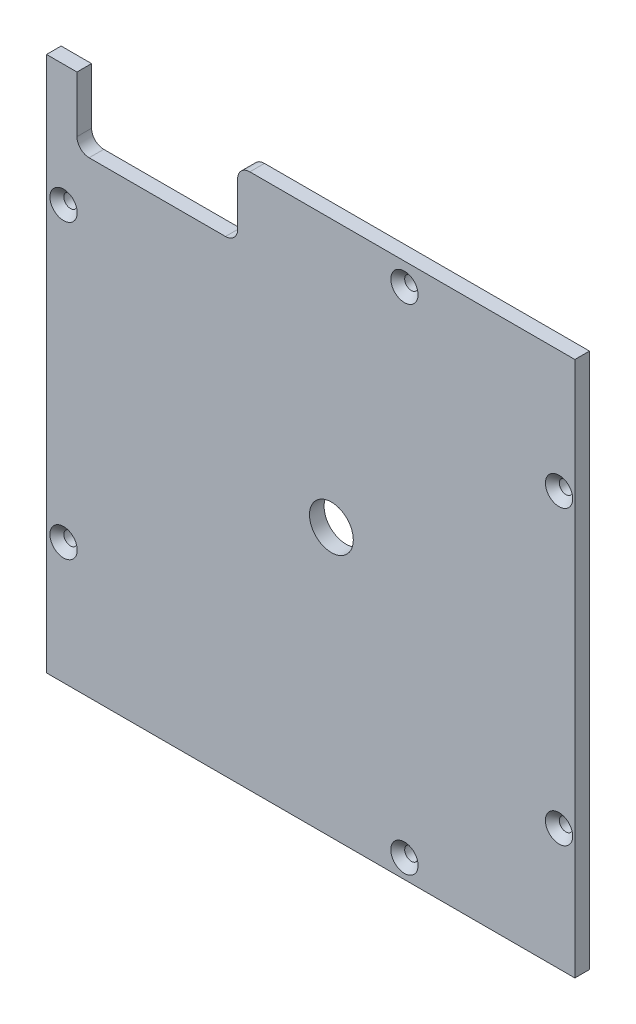
ISO-10303-21;
HEADER;
FILE_DESCRIPTION(('STEP AP214'),'2;1');
FILE_NAME('part.step','',(''),(''),'','','');
FILE_SCHEMA(('AUTOMOTIVE_DESIGN { 1 0 10303 214 1 1 1 1 }'));
ENDSEC;
DATA;
#1=APPLICATION_CONTEXT('core data for automotive mechanical design processes');
#2=APPLICATION_PROTOCOL_DEFINITION('international standard','automotive_design',2000,#1);
#3=PRODUCT_CONTEXT('',#1,'mechanical');
#4=PRODUCT('Part','Part','',(#3));
#5=PRODUCT_RELATED_PRODUCT_CATEGORY('part','',(#4));
#6=PRODUCT_DEFINITION_FORMATION('','',#4);
#7=PRODUCT_DEFINITION_CONTEXT('part definition',#1,'design');
#8=PRODUCT_DEFINITION('design','',#6,#7);
#9=PRODUCT_DEFINITION_SHAPE('','',#8);
#10=(LENGTH_UNIT() NAMED_UNIT(*) SI_UNIT(.MILLI.,.METRE.));
#11=(NAMED_UNIT(*) PLANE_ANGLE_UNIT() SI_UNIT($,.RADIAN.));
#12=(NAMED_UNIT(*) SI_UNIT($,.STERADIAN.) SOLID_ANGLE_UNIT());
#13=UNCERTAINTY_MEASURE_WITH_UNIT(LENGTH_MEASURE(1.E-05),#10,'distance_accuracy_value','');
#14=(GEOMETRIC_REPRESENTATION_CONTEXT(3) GLOBAL_UNCERTAINTY_ASSIGNED_CONTEXT((#13)) GLOBAL_UNIT_ASSIGNED_CONTEXT((#10,
#11,#12)) REPRESENTATION_CONTEXT('',''));
#15=CARTESIAN_POINT('',(0.,0.,0.));
#16=DIRECTION('',(0.,0.,1.));
#17=DIRECTION('',(1.,0.,0.));
#18=AXIS2_PLACEMENT_3D('',#15,#16,#17);
#19=CARTESIAN_POINT('',(-117.,110.,6.));
#20=DIRECTION('',(0.,-1.,0.));
#21=DIRECTION('',(0.,0.,-1.));
#22=AXIS2_PLACEMENT_3D('',#19,#20,#21);
#23=PLANE('',#22);
#24=DIRECTION('',(-1.,0.,0.));
#25=VECTOR('',#24,1.);
#26=CARTESIAN_POINT('',(-117.,110.,6.));
#27=LINE('',#26,#25);
#28=CARTESIAN_POINT('',(-104.5,110.,6.));
#29=VERTEX_POINT('',#28);
#30=CARTESIAN_POINT('',(-117.,110.,6.));
#31=VERTEX_POINT('',#30);
#32=EDGE_CURVE('E138',#29,#31,#27,.T.);
#33=ORIENTED_EDGE('',*,*,#32,.F.);
#34=DIRECTION('',(0.,0.,1.));
#35=VECTOR('',#34,1.);
#36=CARTESIAN_POINT('',(-104.5,110.,0.));
#37=LINE('',#36,#35);
#38=CARTESIAN_POINT('',(-104.5,110.,0.));
#39=VERTEX_POINT('',#38);
#40=EDGE_CURVE('E124',#39,#29,#37,.T.);
#41=ORIENTED_EDGE('',*,*,#40,.F.);
#42=DIRECTION('',(-1.,0.,0.));
#43=VECTOR('',#42,1.);
#44=CARTESIAN_POINT('',(-117.,110.,0.));
#45=LINE('',#44,#43);
#46=CARTESIAN_POINT('',(-117.,110.,0.));
#47=VERTEX_POINT('',#46);
#48=EDGE_CURVE('E136',#39,#47,#45,.T.);
#49=ORIENTED_EDGE('',*,*,#48,.T.);
#50=DIRECTION('',(0.,0.,-1.));
#51=VECTOR('',#50,1.);
#52=CARTESIAN_POINT('',(-117.,110.,6.));
#53=LINE('',#52,#51);
#54=EDGE_CURVE('E155',#31,#47,#53,.T.);
#55=ORIENTED_EDGE('',*,*,#54,.F.);
#56=EDGE_LOOP('',(#33,#41,#49,#55));
#57=FACE_BOUND('',#56,.T.);
#58=ADVANCED_FACE('F36',(#57),#23,.F.);
#59=CARTESIAN_POINT('',(-117.,110.,6.));
#60=DIRECTION('',(1.,0.,0.));
#61=DIRECTION('',(0.,0.,-1.));
#62=AXIS2_PLACEMENT_3D('',#59,#60,#61);
#63=PLANE('',#62);
#64=DIRECTION('',(0.,-1.,0.));
#65=VECTOR('',#64,1.);
#66=CARTESIAN_POINT('',(-117.,110.,0.));
#67=LINE('',#66,#65);
#68=CARTESIAN_POINT('',(-117.,-110.,0.));
#69=VERTEX_POINT('',#68);
#70=EDGE_CURVE('E146',#47,#69,#67,.T.);
#71=ORIENTED_EDGE('',*,*,#70,.T.);
#72=DIRECTION('',(0.,0.,-1.));
#73=VECTOR('',#72,1.);
#74=CARTESIAN_POINT('',(-117.,-110.,6.));
#75=LINE('',#74,#73);
#76=CARTESIAN_POINT('',(-117.,-110.,6.));
#77=VERTEX_POINT('',#76);
#78=EDGE_CURVE('E164',#77,#69,#75,.T.);
#79=ORIENTED_EDGE('',*,*,#78,.F.);
#80=DIRECTION('',(0.,-1.,0.));
#81=VECTOR('',#80,1.);
#82=CARTESIAN_POINT('',(-117.,110.,6.));
#83=LINE('',#82,#81);
#84=EDGE_CURVE('E150',#31,#77,#83,.T.);
#85=ORIENTED_EDGE('',*,*,#84,.F.);
#86=ORIENTED_EDGE('',*,*,#54,.T.);
#87=EDGE_LOOP('',(#71,#79,#85,#86));
#88=FACE_BOUND('',#87,.T.);
#89=ADVANCED_FACE('F298',(#88),#63,.F.);
#90=CARTESIAN_POINT('',(-117.,-110.,6.));
#91=DIRECTION('',(0.,1.,0.));
#92=DIRECTION('',(0.,0.,1.));
#93=AXIS2_PLACEMENT_3D('',#90,#91,#92);
#94=PLANE('',#93);
#95=DIRECTION('',(1.,0.,0.));
#96=VECTOR('',#95,1.);
#97=CARTESIAN_POINT('',(-117.,-110.,0.));
#98=LINE('',#97,#96);
#99=CARTESIAN_POINT('',(100.,-110.,0.));
#100=VERTEX_POINT('',#99);
#101=EDGE_CURVE('E151',#69,#100,#98,.T.);
#102=ORIENTED_EDGE('',*,*,#101,.T.);
#103=DIRECTION('',(0.,0.,-1.));
#104=VECTOR('',#103,1.);
#105=CARTESIAN_POINT('',(100.,-110.,6.));
#106=LINE('',#105,#104);
#107=CARTESIAN_POINT('',(100.,-110.,6.));
#108=VERTEX_POINT('',#107);
#109=EDGE_CURVE('E161',#108,#100,#106,.T.);
#110=ORIENTED_EDGE('',*,*,#109,.F.);
#111=DIRECTION('',(1.,0.,0.));
#112=VECTOR('',#111,1.);
#113=CARTESIAN_POINT('',(-117.,-110.,6.));
#114=LINE('',#113,#112);
#115=EDGE_CURVE('E275',#77,#108,#114,.T.);
#116=ORIENTED_EDGE('',*,*,#115,.F.);
#117=ORIENTED_EDGE('',*,*,#78,.T.);
#118=EDGE_LOOP('',(#102,#110,#116,#117));
#119=FACE_BOUND('',#118,.T.);
#120=ADVANCED_FACE('F282',(#119),#94,.F.);
#121=CARTESIAN_POINT('',(100.,110.,6.));
#122=DIRECTION('',(-1.,0.,0.));
#123=DIRECTION('',(0.,0.,1.));
#124=AXIS2_PLACEMENT_3D('',#121,#122,#123);
#125=PLANE('',#124);
#126=DIRECTION('',(0.,1.,0.));
#127=VECTOR('',#126,1.);
#128=CARTESIAN_POINT('',(100.,110.,0.));
#129=LINE('',#128,#127);
#130=CARTESIAN_POINT('',(100.,110.,0.));
#131=VERTEX_POINT('',#130);
#132=EDGE_CURVE('E148',#100,#131,#129,.T.);
#133=ORIENTED_EDGE('',*,*,#132,.T.);
#134=DIRECTION('',(0.,0.,-1.));
#135=VECTOR('',#134,1.);
#136=CARTESIAN_POINT('',(100.,110.,6.));
#137=LINE('',#136,#135);
#138=CARTESIAN_POINT('',(100.,110.,6.));
#139=VERTEX_POINT('',#138);
#140=EDGE_CURVE('E157',#139,#131,#137,.T.);
#141=ORIENTED_EDGE('',*,*,#140,.F.);
#142=DIRECTION('',(0.,1.,0.));
#143=VECTOR('',#142,1.);
#144=CARTESIAN_POINT('',(100.,110.,6.));
#145=LINE('',#144,#143);
#146=EDGE_CURVE('E277',#108,#139,#145,.T.);
#147=ORIENTED_EDGE('',*,*,#146,.F.);
#148=ORIENTED_EDGE('',*,*,#109,.T.);
#149=EDGE_LOOP('',(#133,#141,#147,#148));
#150=FACE_BOUND('',#149,.T.);
#151=ADVANCED_FACE('F287',(#150),#125,.F.);
#152=CARTESIAN_POINT('',(-33.5,110.,0.));
#153=VERTEX_POINT('',#152);
#154=EDGE_CURVE('E147',#131,#153,#45,.T.);
#155=ORIENTED_EDGE('',*,*,#154,.T.);
#156=DIRECTION('',(0.,0.,1.));
#157=VECTOR('',#156,1.);
#158=CARTESIAN_POINT('',(-33.5,110.,6.));
#159=LINE('',#158,#157);
#160=CARTESIAN_POINT('',(-33.5,110.,6.));
#161=VERTEX_POINT('',#160);
#162=EDGE_CURVE('E178',#153,#161,#159,.T.);
#163=ORIENTED_EDGE('',*,*,#162,.T.);
#164=EDGE_CURVE('E158',#139,#161,#27,.T.);
#165=ORIENTED_EDGE('',*,*,#164,.F.);
#166=ORIENTED_EDGE('',*,*,#140,.T.);
#167=EDGE_LOOP('',(#155,#163,#165,#166));
#168=FACE_BOUND('',#167,.T.);
#169=ADVANCED_FACE('F290',(#168),#23,.F.);
#170=CARTESIAN_POINT('',(0.,0.,6.));
#171=DIRECTION('',(0.,0.,1.));
#172=DIRECTION('',(1.,0.,0.));
#173=AXIS2_PLACEMENT_3D('',#170,#171,#172);
#174=PLANE('',#173);
#175=ORIENTED_EDGE('',*,*,#164,.T.);
#176=CARTESIAN_POINT('',(-33.5,105.,6.));
#177=DIRECTION('',(0.,0.,1.));
#178=DIRECTION('',(1.,0.,0.));
#179=AXIS2_PLACEMENT_3D('',#176,#177,#178);
#180=CIRCLE('',#179,5.);
#181=CARTESIAN_POINT('',(-38.5,105.,6.));
#182=VERTEX_POINT('',#181);
#183=EDGE_CURVE('E51',#161,#182,#180,.T.);
#184=ORIENTED_EDGE('',*,*,#183,.T.);
#185=DIRECTION('',(0.,1.,0.));
#186=VECTOR('',#185,1.);
#187=CARTESIAN_POINT('',(-38.5,110.,6.));
#188=LINE('',#187,#186);
#189=CARTESIAN_POINT('',(-38.5,87.,6.));
#190=VERTEX_POINT('',#189);
#191=EDGE_CURVE('E131',#190,#182,#188,.T.);
#192=ORIENTED_EDGE('',*,*,#191,.F.);
#193=CARTESIAN_POINT('',(-43.5,87.,6.));
#194=DIRECTION('',(0.,0.,1.));
#195=DIRECTION('',(1.,0.,0.));
#196=AXIS2_PLACEMENT_3D('',#193,#194,#195);
#197=CIRCLE('',#196,5.);
#198=CARTESIAN_POINT('',(-43.5,82.,6.));
#199=VERTEX_POINT('',#198);
#200=EDGE_CURVE('E44',#190,#199,#197,.F.);
#201=ORIENTED_EDGE('',*,*,#200,.T.);
#202=DIRECTION('',(1.,0.,0.));
#203=VECTOR('',#202,1.);
#204=CARTESIAN_POINT('',(-104.5,82.,6.));
#205=LINE('',#204,#203);
#206=CARTESIAN_POINT('',(-99.5,82.,6.));
#207=VERTEX_POINT('',#206);
#208=EDGE_CURVE('E192',#207,#199,#205,.T.);
#209=ORIENTED_EDGE('',*,*,#208,.F.);
#210=CARTESIAN_POINT('',(-99.5,87.,6.));
#211=DIRECTION('',(0.,0.,1.));
#212=DIRECTION('',(1.,0.,0.));
#213=AXIS2_PLACEMENT_3D('',#210,#211,#212);
#214=CIRCLE('',#213,5.);
#215=CARTESIAN_POINT('',(-104.5,87.,6.));
#216=VERTEX_POINT('',#215);
#217=EDGE_CURVE('E182',#207,#216,#214,.F.);
#218=ORIENTED_EDGE('',*,*,#217,.T.);
#219=DIRECTION('',(0.,-1.,0.));
#220=VECTOR('',#219,1.);
#221=CARTESIAN_POINT('',(-104.5,110.,6.));
#222=LINE('',#221,#220);
#223=EDGE_CURVE('E202',#29,#216,#222,.T.);
#224=ORIENTED_EDGE('',*,*,#223,.F.);
#225=ORIENTED_EDGE('',*,*,#32,.T.);
#226=ORIENTED_EDGE('',*,*,#84,.T.);
#227=ORIENTED_EDGE('',*,*,#115,.T.);
#228=ORIENTED_EDGE('',*,*,#146,.T.);
#229=EDGE_LOOP('',(#175,#184,#192,#201,#209,#218,#224,#225,#226,#227,#228));
#230=FACE_BOUND('',#229,.T.);
#231=CARTESIAN_POINT('',(0.,0.299999999999981,6.));
#232=DIRECTION('',(0.,0.,1.));
#233=DIRECTION('',(1.,0.,0.));
#234=AXIS2_PLACEMENT_3D('',#231,#232,#233);
#235=CIRCLE('',#234,9.);
#236=CARTESIAN_POINT('',(9.,0.299999999999981,6.));
#237=VERTEX_POINT('',#236);
#238=EDGE_CURVE('E139',#237,#237,#235,.T.);
#239=ORIENTED_EDGE('',*,*,#238,.F.);
#240=EDGE_LOOP('',(#239));
#241=FACE_BOUND('',#240,.T.);
#242=CARTESIAN_POINT('',(-110.,-60.,6.));
#243=DIRECTION('',(0.,0.,1.));
#244=DIRECTION('',(1.,0.,0.));
#245=AXIS2_PLACEMENT_3D('',#242,#243,#244);
#246=CIRCLE('',#245,5.59999999999999);
#247=CARTESIAN_POINT('',(-104.4,-60.,6.));
#248=VERTEX_POINT('',#247);
#249=EDGE_CURVE('E219',#248,#248,#246,.T.);
#250=ORIENTED_EDGE('',*,*,#249,.F.);
#251=EDGE_LOOP('',(#250));
#252=FACE_BOUND('',#251,.T.);
#253=CARTESIAN_POINT('',(-110.,60.,6.));
#254=DIRECTION('',(0.,0.,1.));
#255=DIRECTION('',(1.,0.,0.));
#256=AXIS2_PLACEMENT_3D('',#253,#254,#255);
#257=CIRCLE('',#256,5.59999999999999);
#258=CARTESIAN_POINT('',(-104.4,60.,6.));
#259=VERTEX_POINT('',#258);
#260=EDGE_CURVE('E228',#259,#259,#257,.T.);
#261=ORIENTED_EDGE('',*,*,#260,.F.);
#262=EDGE_LOOP('',(#261));
#263=FACE_BOUND('',#262,.T.);
#264=CARTESIAN_POINT('',(93.5,60.,6.));
#265=DIRECTION('',(0.,0.,1.));
#266=DIRECTION('',(1.,0.,0.));
#267=AXIS2_PLACEMENT_3D('',#264,#265,#266);
#268=CIRCLE('',#267,5.59999999999999);
#269=CARTESIAN_POINT('',(99.1,60.,6.));
#270=VERTEX_POINT('',#269);
#271=EDGE_CURVE('E237',#270,#270,#268,.T.);
#272=ORIENTED_EDGE('',*,*,#271,.F.);
#273=EDGE_LOOP('',(#272));
#274=FACE_BOUND('',#273,.T.);
#275=CARTESIAN_POINT('',(93.5,-60.,6.));
#276=DIRECTION('',(0.,0.,1.));
#277=DIRECTION('',(1.,0.,0.));
#278=AXIS2_PLACEMENT_3D('',#275,#276,#277);
#279=CIRCLE('',#278,5.59999999999999);
#280=CARTESIAN_POINT('',(99.1,-60.,6.));
#281=VERTEX_POINT('',#280);
#282=EDGE_CURVE('E246',#281,#281,#279,.T.);
#283=ORIENTED_EDGE('',*,*,#282,.F.);
#284=EDGE_LOOP('',(#283));
#285=FACE_BOUND('',#284,.T.);
#286=CARTESIAN_POINT('',(30.,-102.194888390628,6.));
#287=DIRECTION('',(0.,0.,1.));
#288=DIRECTION('',(1.,0.,0.));
#289=AXIS2_PLACEMENT_3D('',#286,#287,#288);
#290=CIRCLE('',#289,5.6);
#291=CARTESIAN_POINT('',(35.6,-102.194888390628,6.));
#292=VERTEX_POINT('',#291);
#293=EDGE_CURVE('E255',#292,#292,#290,.T.);
#294=ORIENTED_EDGE('',*,*,#293,.F.);
#295=EDGE_LOOP('',(#294));
#296=FACE_BOUND('',#295,.T.);
#297=CARTESIAN_POINT('',(30.,100.827560783671,6.));
#298=DIRECTION('',(0.,0.,1.));
#299=DIRECTION('',(1.,0.,0.));
#300=AXIS2_PLACEMENT_3D('',#297,#298,#299);
#301=CIRCLE('',#300,5.6);
#302=CARTESIAN_POINT('',(35.6,100.827560783671,6.));
#303=VERTEX_POINT('',#302);
#304=EDGE_CURVE('E264',#303,#303,#301,.T.);
#305=ORIENTED_EDGE('',*,*,#304,.F.);
#306=EDGE_LOOP('',(#305));
#307=FACE_BOUND('',#306,.T.);
#308=ADVANCED_FACE('F190',(#230,#241,#252,#263,#274,#285,#296,#307),#174,.T.);
#309=CARTESIAN_POINT('',(0.,0.,0.));
#310=DIRECTION('',(0.,0.,1.));
#311=DIRECTION('',(1.,0.,0.));
#312=AXIS2_PLACEMENT_3D('',#309,#310,#311);
#313=PLANE('',#312);
#314=DIRECTION('',(0.,1.,0.));
#315=VECTOR('',#314,1.);
#316=CARTESIAN_POINT('',(-38.5,110.,0.));
#317=LINE('',#316,#315);
#318=CARTESIAN_POINT('',(-38.5,87.,0.));
#319=VERTEX_POINT('',#318);
#320=CARTESIAN_POINT('',(-38.5,105.,0.));
#321=VERTEX_POINT('',#320);
#322=EDGE_CURVE('E140',#319,#321,#317,.T.);
#323=ORIENTED_EDGE('',*,*,#322,.T.);
#324=CARTESIAN_POINT('',(-33.5,105.,0.));
#325=DIRECTION('',(0.,0.,1.));
#326=DIRECTION('',(1.,0.,0.));
#327=AXIS2_PLACEMENT_3D('',#324,#325,#326);
#328=CIRCLE('',#327,5.);
#329=EDGE_CURVE('E59',#321,#153,#328,.F.);
#330=ORIENTED_EDGE('',*,*,#329,.T.);
#331=ORIENTED_EDGE('',*,*,#154,.F.);
#332=ORIENTED_EDGE('',*,*,#132,.F.);
#333=ORIENTED_EDGE('',*,*,#101,.F.);
#334=ORIENTED_EDGE('',*,*,#70,.F.);
#335=ORIENTED_EDGE('',*,*,#48,.F.);
#336=DIRECTION('',(0.,-1.,0.));
#337=VECTOR('',#336,1.);
#338=CARTESIAN_POINT('',(-104.5,110.,0.));
#339=LINE('',#338,#337);
#340=CARTESIAN_POINT('',(-104.5,87.,0.));
#341=VERTEX_POINT('',#340);
#342=EDGE_CURVE('E120',#39,#341,#339,.T.);
#343=ORIENTED_EDGE('',*,*,#342,.T.);
#344=CARTESIAN_POINT('',(-99.5,87.,0.));
#345=DIRECTION('',(0.,0.,1.));
#346=DIRECTION('',(1.,0.,0.));
#347=AXIS2_PLACEMENT_3D('',#344,#345,#346);
#348=CIRCLE('',#347,5.);
#349=CARTESIAN_POINT('',(-99.5,82.,0.));
#350=VERTEX_POINT('',#349);
#351=EDGE_CURVE('E184',#341,#350,#348,.T.);
#352=ORIENTED_EDGE('',*,*,#351,.T.);
#353=DIRECTION('',(1.,0.,0.));
#354=VECTOR('',#353,1.);
#355=CARTESIAN_POINT('',(-104.5,82.,0.));
#356=LINE('',#355,#354);
#357=CARTESIAN_POINT('',(-43.5,82.,0.));
#358=VERTEX_POINT('',#357);
#359=EDGE_CURVE('E130',#350,#358,#356,.T.);
#360=ORIENTED_EDGE('',*,*,#359,.T.);
#361=CARTESIAN_POINT('',(-43.5,87.,0.));
#362=DIRECTION('',(0.,0.,1.));
#363=DIRECTION('',(1.,0.,0.));
#364=AXIS2_PLACEMENT_3D('',#361,#362,#363);
#365=CIRCLE('',#364,5.);
#366=EDGE_CURVE('E11',#358,#319,#365,.T.);
#367=ORIENTED_EDGE('',*,*,#366,.T.);
#368=EDGE_LOOP('',(#323,#330,#331,#332,#333,#334,#335,#343,#352,#360,#367));
#369=FACE_BOUND('',#368,.T.);
#370=CARTESIAN_POINT('',(0.,0.299999999999981,0.));
#371=DIRECTION('',(0.,0.,1.));
#372=DIRECTION('',(1.,0.,0.));
#373=AXIS2_PLACEMENT_3D('',#370,#371,#372);
#374=CIRCLE('',#373,9.);
#375=CARTESIAN_POINT('',(9.,0.299999999999981,0.));
#376=VERTEX_POINT('',#375);
#377=EDGE_CURVE('E216',#376,#376,#374,.F.);
#378=ORIENTED_EDGE('',*,*,#377,.F.);
#379=EDGE_LOOP('',(#378));
#380=FACE_BOUND('',#379,.T.);
#381=CARTESIAN_POINT('',(-110.,-60.,0.));
#382=DIRECTION('',(0.,0.,1.));
#383=DIRECTION('',(1.,0.,0.));
#384=AXIS2_PLACEMENT_3D('',#381,#382,#383);
#385=CIRCLE('',#384,2.75);
#386=CARTESIAN_POINT('',(-107.25,-60.,0.));
#387=VERTEX_POINT('',#386);
#388=EDGE_CURVE('E225',#387,#387,#385,.T.);
#389=ORIENTED_EDGE('',*,*,#388,.T.);
#390=EDGE_LOOP('',(#389));
#391=FACE_BOUND('',#390,.T.);
#392=CARTESIAN_POINT('',(-110.,60.,0.));
#393=DIRECTION('',(0.,0.,1.));
#394=DIRECTION('',(1.,0.,0.));
#395=AXIS2_PLACEMENT_3D('',#392,#393,#394);
#396=CIRCLE('',#395,2.75);
#397=CARTESIAN_POINT('',(-107.25,60.,0.));
#398=VERTEX_POINT('',#397);
#399=EDGE_CURVE('E234',#398,#398,#396,.T.);
#400=ORIENTED_EDGE('',*,*,#399,.T.);
#401=EDGE_LOOP('',(#400));
#402=FACE_BOUND('',#401,.T.);
#403=CARTESIAN_POINT('',(93.5,60.,0.));
#404=DIRECTION('',(0.,0.,1.));
#405=DIRECTION('',(1.,0.,0.));
#406=AXIS2_PLACEMENT_3D('',#403,#404,#405);
#407=CIRCLE('',#406,2.75);
#408=CARTESIAN_POINT('',(96.25,60.,0.));
#409=VERTEX_POINT('',#408);
#410=EDGE_CURVE('E243',#409,#409,#407,.T.);
#411=ORIENTED_EDGE('',*,*,#410,.T.);
#412=EDGE_LOOP('',(#411));
#413=FACE_BOUND('',#412,.T.);
#414=CARTESIAN_POINT('',(93.5,-60.,0.));
#415=DIRECTION('',(0.,0.,1.));
#416=DIRECTION('',(1.,0.,0.));
#417=AXIS2_PLACEMENT_3D('',#414,#415,#416);
#418=CIRCLE('',#417,2.75);
#419=CARTESIAN_POINT('',(96.25,-60.,0.));
#420=VERTEX_POINT('',#419);
#421=EDGE_CURVE('E252',#420,#420,#418,.T.);
#422=ORIENTED_EDGE('',*,*,#421,.T.);
#423=EDGE_LOOP('',(#422));
#424=FACE_BOUND('',#423,.T.);
#425=CARTESIAN_POINT('',(30.,-102.194888390628,0.));
#426=DIRECTION('',(0.,0.,1.));
#427=DIRECTION('',(1.,0.,0.));
#428=AXIS2_PLACEMENT_3D('',#425,#426,#427);
#429=CIRCLE('',#428,2.75);
#430=CARTESIAN_POINT('',(32.75,-102.194888390628,0.));
#431=VERTEX_POINT('',#430);
#432=EDGE_CURVE('E261',#431,#431,#429,.T.);
#433=ORIENTED_EDGE('',*,*,#432,.T.);
#434=EDGE_LOOP('',(#433));
#435=FACE_BOUND('',#434,.T.);
#436=CARTESIAN_POINT('',(30.,100.827560783671,0.));
#437=DIRECTION('',(0.,0.,1.));
#438=DIRECTION('',(1.,0.,0.));
#439=AXIS2_PLACEMENT_3D('',#436,#437,#438);
#440=CIRCLE('',#439,2.75);
#441=CARTESIAN_POINT('',(32.75,100.827560783671,0.));
#442=VERTEX_POINT('',#441);
#443=EDGE_CURVE('E270',#442,#442,#440,.T.);
#444=ORIENTED_EDGE('',*,*,#443,.T.);
#445=EDGE_LOOP('',(#444));
#446=FACE_BOUND('',#445,.T.);
#447=ADVANCED_FACE('F143',(#369,#380,#391,#402,#413,#424,#435,#446),#313,.F.);
#448=CARTESIAN_POINT('',(30.,100.827560783671,6.));
#449=DIRECTION('',(0.,0.,1.));
#450=DIRECTION('',(1.,0.,0.));
#451=AXIS2_PLACEMENT_3D('',#448,#449,#450);
#452=CYLINDRICAL_SURFACE('',#451,2.75);
#453=ORIENTED_EDGE('',*,*,#443,.F.);
#454=EDGE_LOOP('',(#453));
#455=FACE_BOUND('',#454,.T.);
#456=CARTESIAN_POINT('',(30.,100.827560783671,3.15));
#457=DIRECTION('',(0.,0.,1.));
#458=DIRECTION('',(1.,0.,0.));
#459=AXIS2_PLACEMENT_3D('',#456,#457,#458);
#460=CIRCLE('',#459,2.75);
#461=CARTESIAN_POINT('',(32.75,100.827560783671,3.15));
#462=VERTEX_POINT('',#461);
#463=EDGE_CURVE('E267',#462,#462,#460,.T.);
#464=ORIENTED_EDGE('',*,*,#463,.T.);
#465=EDGE_LOOP('',(#464));
#466=FACE_BOUND('',#465,.T.);
#467=ADVANCED_FACE('F379',(#455,#466),#452,.F.);
#468=CARTESIAN_POINT('',(30.,100.827560783671,6.));
#469=DIRECTION('',(0.,0.,1.));
#470=DIRECTION('',(1.,0.,0.));
#471=AXIS2_PLACEMENT_3D('',#468,#469,#470);
#472=CONICAL_SURFACE('',#471,5.6,0.785398163397448);
#473=ORIENTED_EDGE('',*,*,#463,.F.);
#474=EDGE_LOOP('',(#473));
#475=FACE_BOUND('',#474,.T.);
#476=ORIENTED_EDGE('',*,*,#304,.T.);
#477=EDGE_LOOP('',(#476));
#478=FACE_BOUND('',#477,.T.);
#479=ADVANCED_FACE('F375',(#475,#478),#472,.F.);
#480=CARTESIAN_POINT('',(30.,-102.194888390628,6.));
#481=DIRECTION('',(0.,0.,1.));
#482=DIRECTION('',(1.,0.,0.));
#483=AXIS2_PLACEMENT_3D('',#480,#481,#482);
#484=CYLINDRICAL_SURFACE('',#483,2.75);
#485=ORIENTED_EDGE('',*,*,#432,.F.);
#486=EDGE_LOOP('',(#485));
#487=FACE_BOUND('',#486,.T.);
#488=CARTESIAN_POINT('',(30.,-102.194888390628,3.15));
#489=DIRECTION('',(0.,0.,1.));
#490=DIRECTION('',(1.,0.,0.));
#491=AXIS2_PLACEMENT_3D('',#488,#489,#490);
#492=CIRCLE('',#491,2.75);
#493=CARTESIAN_POINT('',(32.75,-102.194888390628,3.15));
#494=VERTEX_POINT('',#493);
#495=EDGE_CURVE('E258',#494,#494,#492,.T.);
#496=ORIENTED_EDGE('',*,*,#495,.T.);
#497=EDGE_LOOP('',(#496));
#498=FACE_BOUND('',#497,.T.);
#499=ADVANCED_FACE('F371',(#487,#498),#484,.F.);
#500=CARTESIAN_POINT('',(30.,-102.194888390628,6.));
#501=DIRECTION('',(0.,0.,1.));
#502=DIRECTION('',(1.,0.,0.));
#503=AXIS2_PLACEMENT_3D('',#500,#501,#502);
#504=CONICAL_SURFACE('',#503,5.6,0.785398163397448);
#505=ORIENTED_EDGE('',*,*,#495,.F.);
#506=EDGE_LOOP('',(#505));
#507=FACE_BOUND('',#506,.T.);
#508=ORIENTED_EDGE('',*,*,#293,.T.);
#509=EDGE_LOOP('',(#508));
#510=FACE_BOUND('',#509,.T.);
#511=ADVANCED_FACE('F367',(#507,#510),#504,.F.);
#512=CARTESIAN_POINT('',(93.5,-60.,6.));
#513=DIRECTION('',(0.,0.,1.));
#514=DIRECTION('',(1.,0.,0.));
#515=AXIS2_PLACEMENT_3D('',#512,#513,#514);
#516=CYLINDRICAL_SURFACE('',#515,2.75);
#517=ORIENTED_EDGE('',*,*,#421,.F.);
#518=EDGE_LOOP('',(#517));
#519=FACE_BOUND('',#518,.T.);
#520=CARTESIAN_POINT('',(93.5,-60.,3.15));
#521=DIRECTION('',(0.,0.,1.));
#522=DIRECTION('',(1.,0.,0.));
#523=AXIS2_PLACEMENT_3D('',#520,#521,#522);
#524=CIRCLE('',#523,2.75);
#525=CARTESIAN_POINT('',(96.25,-60.,3.15));
#526=VERTEX_POINT('',#525);
#527=EDGE_CURVE('E249',#526,#526,#524,.T.);
#528=ORIENTED_EDGE('',*,*,#527,.T.);
#529=EDGE_LOOP('',(#528));
#530=FACE_BOUND('',#529,.T.);
#531=ADVANCED_FACE('F363',(#519,#530),#516,.F.);
#532=CARTESIAN_POINT('',(93.5,-60.,6.));
#533=DIRECTION('',(0.,0.,1.));
#534=DIRECTION('',(1.,0.,0.));
#535=AXIS2_PLACEMENT_3D('',#532,#533,#534);
#536=CONICAL_SURFACE('',#535,5.59999999999999,0.785398163397447);
#537=ORIENTED_EDGE('',*,*,#527,.F.);
#538=EDGE_LOOP('',(#537));
#539=FACE_BOUND('',#538,.T.);
#540=ORIENTED_EDGE('',*,*,#282,.T.);
#541=EDGE_LOOP('',(#540));
#542=FACE_BOUND('',#541,.T.);
#543=ADVANCED_FACE('F359',(#539,#542),#536,.F.);
#544=CARTESIAN_POINT('',(93.5,60.,6.));
#545=DIRECTION('',(0.,0.,1.));
#546=DIRECTION('',(1.,0.,0.));
#547=AXIS2_PLACEMENT_3D('',#544,#545,#546);
#548=CYLINDRICAL_SURFACE('',#547,2.75);
#549=ORIENTED_EDGE('',*,*,#410,.F.);
#550=EDGE_LOOP('',(#549));
#551=FACE_BOUND('',#550,.T.);
#552=CARTESIAN_POINT('',(93.5,60.,3.15));
#553=DIRECTION('',(0.,0.,1.));
#554=DIRECTION('',(1.,0.,0.));
#555=AXIS2_PLACEMENT_3D('',#552,#553,#554);
#556=CIRCLE('',#555,2.75);
#557=CARTESIAN_POINT('',(96.25,60.,3.15));
#558=VERTEX_POINT('',#557);
#559=EDGE_CURVE('E240',#558,#558,#556,.T.);
#560=ORIENTED_EDGE('',*,*,#559,.T.);
#561=EDGE_LOOP('',(#560));
#562=FACE_BOUND('',#561,.T.);
#563=ADVANCED_FACE('F355',(#551,#562),#548,.F.);
#564=CARTESIAN_POINT('',(93.5,60.,6.));
#565=DIRECTION('',(0.,0.,1.));
#566=DIRECTION('',(1.,0.,0.));
#567=AXIS2_PLACEMENT_3D('',#564,#565,#566);
#568=CONICAL_SURFACE('',#567,5.59999999999999,0.785398163397447);
#569=ORIENTED_EDGE('',*,*,#559,.F.);
#570=EDGE_LOOP('',(#569));
#571=FACE_BOUND('',#570,.T.);
#572=ORIENTED_EDGE('',*,*,#271,.T.);
#573=EDGE_LOOP('',(#572));
#574=FACE_BOUND('',#573,.T.);
#575=ADVANCED_FACE('F351',(#571,#574),#568,.F.);
#576=CARTESIAN_POINT('',(-110.,60.,6.));
#577=DIRECTION('',(0.,0.,1.));
#578=DIRECTION('',(1.,0.,0.));
#579=AXIS2_PLACEMENT_3D('',#576,#577,#578);
#580=CYLINDRICAL_SURFACE('',#579,2.75);
#581=ORIENTED_EDGE('',*,*,#399,.F.);
#582=EDGE_LOOP('',(#581));
#583=FACE_BOUND('',#582,.T.);
#584=CARTESIAN_POINT('',(-110.,60.,3.15));
#585=DIRECTION('',(0.,0.,1.));
#586=DIRECTION('',(1.,0.,0.));
#587=AXIS2_PLACEMENT_3D('',#584,#585,#586);
#588=CIRCLE('',#587,2.75);
#589=CARTESIAN_POINT('',(-107.25,60.,3.15));
#590=VERTEX_POINT('',#589);
#591=EDGE_CURVE('E231',#590,#590,#588,.T.);
#592=ORIENTED_EDGE('',*,*,#591,.T.);
#593=EDGE_LOOP('',(#592));
#594=FACE_BOUND('',#593,.T.);
#595=ADVANCED_FACE('F347',(#583,#594),#580,.F.);
#596=CARTESIAN_POINT('',(-110.,60.,6.));
#597=DIRECTION('',(0.,0.,1.));
#598=DIRECTION('',(1.,0.,0.));
#599=AXIS2_PLACEMENT_3D('',#596,#597,#598);
#600=CONICAL_SURFACE('',#599,5.59999999999999,0.785398163397447);
#601=ORIENTED_EDGE('',*,*,#591,.F.);
#602=EDGE_LOOP('',(#601));
#603=FACE_BOUND('',#602,.T.);
#604=ORIENTED_EDGE('',*,*,#260,.T.);
#605=EDGE_LOOP('',(#604));
#606=FACE_BOUND('',#605,.T.);
#607=ADVANCED_FACE('F343',(#603,#606),#600,.F.);
#608=CARTESIAN_POINT('',(-110.,-60.,6.));
#609=DIRECTION('',(0.,0.,1.));
#610=DIRECTION('',(1.,0.,0.));
#611=AXIS2_PLACEMENT_3D('',#608,#609,#610);
#612=CYLINDRICAL_SURFACE('',#611,2.75);
#613=ORIENTED_EDGE('',*,*,#388,.F.);
#614=EDGE_LOOP('',(#613));
#615=FACE_BOUND('',#614,.T.);
#616=CARTESIAN_POINT('',(-110.,-60.,3.15));
#617=DIRECTION('',(0.,0.,1.));
#618=DIRECTION('',(1.,0.,0.));
#619=AXIS2_PLACEMENT_3D('',#616,#617,#618);
#620=CIRCLE('',#619,2.75);
#621=CARTESIAN_POINT('',(-107.25,-60.,3.15));
#622=VERTEX_POINT('',#621);
#623=EDGE_CURVE('E222',#622,#622,#620,.T.);
#624=ORIENTED_EDGE('',*,*,#623,.T.);
#625=EDGE_LOOP('',(#624));
#626=FACE_BOUND('',#625,.T.);
#627=ADVANCED_FACE('F339',(#615,#626),#612,.F.);
#628=CARTESIAN_POINT('',(-110.,-60.,6.));
#629=DIRECTION('',(0.,0.,1.));
#630=DIRECTION('',(1.,0.,0.));
#631=AXIS2_PLACEMENT_3D('',#628,#629,#630);
#632=CONICAL_SURFACE('',#631,5.59999999999999,0.785398163397447);
#633=ORIENTED_EDGE('',*,*,#623,.F.);
#634=EDGE_LOOP('',(#633));
#635=FACE_BOUND('',#634,.T.);
#636=ORIENTED_EDGE('',*,*,#249,.T.);
#637=EDGE_LOOP('',(#636));
#638=FACE_BOUND('',#637,.T.);
#639=ADVANCED_FACE('F335',(#635,#638),#632,.F.);
#640=CARTESIAN_POINT('',(0.,0.299999999999981,-0.00100000000000013));
#641=DIRECTION('',(0.,0.,1.));
#642=DIRECTION('',(1.,0.,0.));
#643=AXIS2_PLACEMENT_3D('',#640,#641,#642);
#644=CYLINDRICAL_SURFACE('',#643,9.);
#645=CARTESIAN_POINT('',(9.,0.299999999999981,6.));
#646=CARTESIAN_POINT('',(9.,0.299999999999981,5.9375));
#647=CARTESIAN_POINT('',(9.,0.299999999999981,5.875));
#648=CARTESIAN_POINT('',(9.,0.299999999999981,5.75));
#649=CARTESIAN_POINT('',(9.,0.299999999999981,5.6875));
#650=CARTESIAN_POINT('',(9.,0.299999999999981,5.5625));
#651=CARTESIAN_POINT('',(9.,0.299999999999981,5.5));
#652=CARTESIAN_POINT('',(9.,0.299999999999981,5.375));
#653=CARTESIAN_POINT('',(9.,0.299999999999981,5.3125));
#654=CARTESIAN_POINT('',(9.,0.299999999999981,5.1875));
#655=CARTESIAN_POINT('',(9.,0.299999999999981,5.125));
#656=CARTESIAN_POINT('',(9.,0.299999999999981,5.));
#657=CARTESIAN_POINT('',(9.,0.299999999999981,4.9375));
#658=CARTESIAN_POINT('',(9.,0.299999999999981,4.8125));
#659=CARTESIAN_POINT('',(9.,0.299999999999981,4.75));
#660=CARTESIAN_POINT('',(9.,0.299999999999981,4.625));
#661=CARTESIAN_POINT('',(9.,0.299999999999981,4.5625));
#662=CARTESIAN_POINT('',(9.,0.299999999999981,4.4375));
#663=CARTESIAN_POINT('',(9.,0.299999999999981,4.375));
#664=CARTESIAN_POINT('',(9.,0.299999999999981,4.25));
#665=CARTESIAN_POINT('',(9.,0.299999999999981,4.1875));
#666=CARTESIAN_POINT('',(9.,0.299999999999981,4.0625));
#667=CARTESIAN_POINT('',(9.,0.299999999999981,4.));
#668=CARTESIAN_POINT('',(9.,0.299999999999981,3.875));
#669=CARTESIAN_POINT('',(9.,0.299999999999981,3.8125));
#670=CARTESIAN_POINT('',(9.,0.299999999999981,3.6875));
#671=CARTESIAN_POINT('',(9.,0.299999999999981,3.625));
#672=CARTESIAN_POINT('',(9.,0.299999999999981,3.5));
#673=CARTESIAN_POINT('',(9.,0.299999999999981,3.4375));
#674=CARTESIAN_POINT('',(9.,0.299999999999981,3.3125));
#675=CARTESIAN_POINT('',(9.,0.299999999999981,3.25));
#676=CARTESIAN_POINT('',(9.,0.299999999999981,3.125));
#677=CARTESIAN_POINT('',(9.,0.299999999999981,3.0625));
#678=CARTESIAN_POINT('',(9.,0.299999999999981,2.9375));
#679=CARTESIAN_POINT('',(9.,0.299999999999981,2.875));
#680=CARTESIAN_POINT('',(9.,0.299999999999981,2.75));
#681=CARTESIAN_POINT('',(9.,0.299999999999981,2.6875));
#682=CARTESIAN_POINT('',(9.,0.299999999999981,2.5625));
#683=CARTESIAN_POINT('',(9.,0.299999999999981,2.5));
#684=CARTESIAN_POINT('',(9.,0.299999999999981,2.375));
#685=CARTESIAN_POINT('',(9.,0.299999999999981,2.3125));
#686=CARTESIAN_POINT('',(9.,0.299999999999981,2.1875));
#687=CARTESIAN_POINT('',(9.,0.299999999999981,2.125));
#688=CARTESIAN_POINT('',(9.,0.299999999999981,2.));
#689=CARTESIAN_POINT('',(9.,0.299999999999981,1.9375));
#690=CARTESIAN_POINT('',(9.,0.299999999999981,1.8125));
#691=CARTESIAN_POINT('',(9.,0.299999999999981,1.75));
#692=CARTESIAN_POINT('',(9.,0.299999999999981,1.625));
#693=CARTESIAN_POINT('',(9.,0.299999999999981,1.5625));
#694=CARTESIAN_POINT('',(9.,0.299999999999981,1.4375));
#695=CARTESIAN_POINT('',(9.,0.299999999999981,1.375));
#696=CARTESIAN_POINT('',(9.,0.299999999999981,1.25));
#697=CARTESIAN_POINT('',(9.,0.299999999999981,1.1875));
#698=CARTESIAN_POINT('',(9.,0.299999999999981,1.0625));
#699=CARTESIAN_POINT('',(9.,0.299999999999981,1.));
#700=CARTESIAN_POINT('',(9.,0.299999999999981,0.875));
#701=CARTESIAN_POINT('',(9.,0.299999999999981,0.8125));
#702=CARTESIAN_POINT('',(9.,0.299999999999981,0.6875));
#703=CARTESIAN_POINT('',(9.,0.299999999999981,0.625));
#704=CARTESIAN_POINT('',(9.,0.299999999999981,0.5));
#705=CARTESIAN_POINT('',(9.,0.299999999999981,0.4375));
#706=CARTESIAN_POINT('',(9.,0.299999999999981,0.3125));
#707=CARTESIAN_POINT('',(9.,0.299999999999981,0.25));
#708=CARTESIAN_POINT('',(9.,0.299999999999981,0.125));
#709=CARTESIAN_POINT('',(9.,0.299999999999981,0.0625000000000001));
#710=CARTESIAN_POINT('',(9.,0.299999999999981,0.));
#711=B_SPLINE_CURVE_WITH_KNOTS('',3,(#645,#646,#647,#648,#649,#650,#651,#652,#653,#654,#655,
#656,#657,#658,#659,#660,#661,#662,#663,#664,#665,#666,#667,#668,#669,#670,#671,#672,#673,#674,
#675,#676,#677,#678,#679,#680,#681,#682,#683,#684,#685,#686,#687,#688,#689,#690,#691,#692,#693,
#694,#695,#696,#697,#698,#699,#700,#701,#702,#703,#704,#705,#706,#707,#708,#709,#710),
.UNSPECIFIED.,.F.,.F.,(4,2,2,2,2,2,2,2,2,2,2,2,2,2,2,2,2,2,2,2,2,2,2,2,2,2,2,2,2,2,2,2,4),(0.,
0.1875,0.375,0.5625,0.75,0.9375,1.125,1.3125,1.5,1.6875,1.875,2.0625,2.25,2.4375,2.625,2.8125,
3.,3.1875,3.375,3.5625,3.75,3.9375,4.125,4.3125,4.5,4.6875,4.875,5.0625,5.25,5.4375,5.625,
5.8125,6.),.UNSPECIFIED.);
#712=EDGE_CURVE('BSEAM332',#237,#376,#711,.T.);
#713=ORIENTED_EDGE('',*,*,#238,.T.);
#714=ORIENTED_EDGE('',*,*,#377,.T.);
#715=ORIENTED_EDGE('',*,*,#712,.T.);
#716=ORIENTED_EDGE('',*,*,#712,.F.);
#717=EDGE_LOOP('',(#713,#715,#714,#716));
#718=FACE_BOUND('',#717,.T.);
#719=ADVANCED_FACE('F332',(#718),#644,.F.);
#720=CARTESIAN_POINT('',(-104.5,110.,0.));
#721=DIRECTION('',(-1.,0.,0.));
#722=DIRECTION('',(0.,0.,1.));
#723=AXIS2_PLACEMENT_3D('',#720,#721,#722);
#724=PLANE('',#723);
#725=ORIENTED_EDGE('',*,*,#223,.T.);
#726=DIRECTION('',(0.,0.,1.));
#727=VECTOR('',#726,1.);
#728=CARTESIAN_POINT('',(-104.5,87.,0.));
#729=LINE('',#728,#727);
#730=EDGE_CURVE('E127',#216,#341,#729,.F.);
#731=ORIENTED_EDGE('',*,*,#730,.T.);
#732=ORIENTED_EDGE('',*,*,#342,.F.);
#733=ORIENTED_EDGE('',*,*,#40,.T.);
#734=EDGE_LOOP('',(#725,#731,#732,#733));
#735=FACE_BOUND('',#734,.T.);
#736=ADVANCED_FACE('F123',(#735),#724,.F.);
#737=CARTESIAN_POINT('',(-38.5,110.,0.));
#738=DIRECTION('',(1.,0.,0.));
#739=DIRECTION('',(0.,1.,0.));
#740=AXIS2_PLACEMENT_3D('',#737,#738,#739);
#741=PLANE('',#740);
#742=ORIENTED_EDGE('',*,*,#322,.F.);
#743=DIRECTION('',(0.,0.,1.));
#744=VECTOR('',#743,1.);
#745=CARTESIAN_POINT('',(-38.5,87.,6.));
#746=LINE('',#745,#744);
#747=EDGE_CURVE('E175',#319,#190,#746,.T.);
#748=ORIENTED_EDGE('',*,*,#747,.T.);
#749=ORIENTED_EDGE('',*,*,#191,.T.);
#750=DIRECTION('',(0.,0.,1.));
#751=VECTOR('',#750,1.);
#752=CARTESIAN_POINT('',(-38.5,105.,0.));
#753=LINE('',#752,#751);
#754=EDGE_CURVE('E173',#182,#321,#753,.F.);
#755=ORIENTED_EDGE('',*,*,#754,.T.);
#756=EDGE_LOOP('',(#742,#748,#749,#755));
#757=FACE_BOUND('',#756,.T.);
#758=ADVANCED_FACE('F208',(#757),#741,.F.);
#759=CARTESIAN_POINT('',(-104.5,82.,0.));
#760=DIRECTION('',(0.,-1.,0.));
#761=DIRECTION('',(0.,0.,-1.));
#762=AXIS2_PLACEMENT_3D('',#759,#760,#761);
#763=PLANE('',#762);
#764=ORIENTED_EDGE('',*,*,#359,.F.);
#765=DIRECTION('',(0.,0.,1.));
#766=VECTOR('',#765,1.);
#767=CARTESIAN_POINT('',(-99.5,82.,6.));
#768=LINE('',#767,#766);
#769=EDGE_CURVE('E169',#350,#207,#768,.T.);
#770=ORIENTED_EDGE('',*,*,#769,.T.);
#771=ORIENTED_EDGE('',*,*,#208,.T.);
#772=DIRECTION('',(0.,0.,1.));
#773=VECTOR('',#772,1.);
#774=CARTESIAN_POINT('',(-43.5,82.,0.));
#775=LINE('',#774,#773);
#776=EDGE_CURVE('E167',#199,#358,#775,.F.);
#777=ORIENTED_EDGE('',*,*,#776,.T.);
#778=EDGE_LOOP('',(#764,#770,#771,#777));
#779=FACE_BOUND('',#778,.T.);
#780=ADVANCED_FACE('F199',(#779),#763,.F.);
#781=CARTESIAN_POINT('',(-99.5,87.,0.));
#782=DIRECTION('',(0.,0.,-1.));
#783=DIRECTION('',(-1.,0.,0.));
#784=AXIS2_PLACEMENT_3D('',#781,#782,#783);
#785=CYLINDRICAL_SURFACE('',#784,5.);
#786=ORIENTED_EDGE('',*,*,#351,.F.);
#787=ORIENTED_EDGE('',*,*,#730,.F.);
#788=ORIENTED_EDGE('',*,*,#217,.F.);
#789=ORIENTED_EDGE('',*,*,#769,.F.);
#790=EDGE_LOOP('',(#786,#787,#788,#789));
#791=FACE_BOUND('',#790,.T.);
#792=ADVANCED_FACE('F296',(#791),#785,.F.);
#793=CARTESIAN_POINT('',(-43.5,87.,0.));
#794=DIRECTION('',(0.,0.,-1.));
#795=DIRECTION('',(-1.,0.,0.));
#796=AXIS2_PLACEMENT_3D('',#793,#794,#795);
#797=CYLINDRICAL_SURFACE('',#796,5.);
#798=ORIENTED_EDGE('',*,*,#366,.F.);
#799=ORIENTED_EDGE('',*,*,#776,.F.);
#800=ORIENTED_EDGE('',*,*,#200,.F.);
#801=ORIENTED_EDGE('',*,*,#747,.F.);
#802=EDGE_LOOP('',(#798,#799,#800,#801));
#803=FACE_BOUND('',#802,.T.);
#804=ADVANCED_FACE('F205',(#803),#797,.F.);
#805=CARTESIAN_POINT('',(-33.5,105.,6.));
#806=DIRECTION('',(0.,0.,1.));
#807=DIRECTION('',(1.,0.,0.));
#808=AXIS2_PLACEMENT_3D('',#805,#806,#807);
#809=CYLINDRICAL_SURFACE('',#808,5.);
#810=ORIENTED_EDGE('',*,*,#329,.F.);
#811=ORIENTED_EDGE('',*,*,#754,.F.);
#812=ORIENTED_EDGE('',*,*,#183,.F.);
#813=ORIENTED_EDGE('',*,*,#162,.F.);
#814=EDGE_LOOP('',(#810,#811,#812,#813));
#815=FACE_BOUND('',#814,.T.);
#816=ADVANCED_FACE('F38',(#815),#809,.T.);
#817=CLOSED_SHELL('',(#58,#89,#120,#151,#169,#308,#447,#467,#479,#499,#511,#531,#543,#563,#575,
#595,#607,#627,#639,#719,#736,#758,#780,#792,#804,#816));
#818=MANIFOLD_SOLID_BREP('B2',#817);
#819=ADVANCED_BREP_SHAPE_REPRESENTATION('',(#18,#818),#14);
#820=SHAPE_DEFINITION_REPRESENTATION(#9,#819);
ENDSEC;
END-ISO-10303-21;
